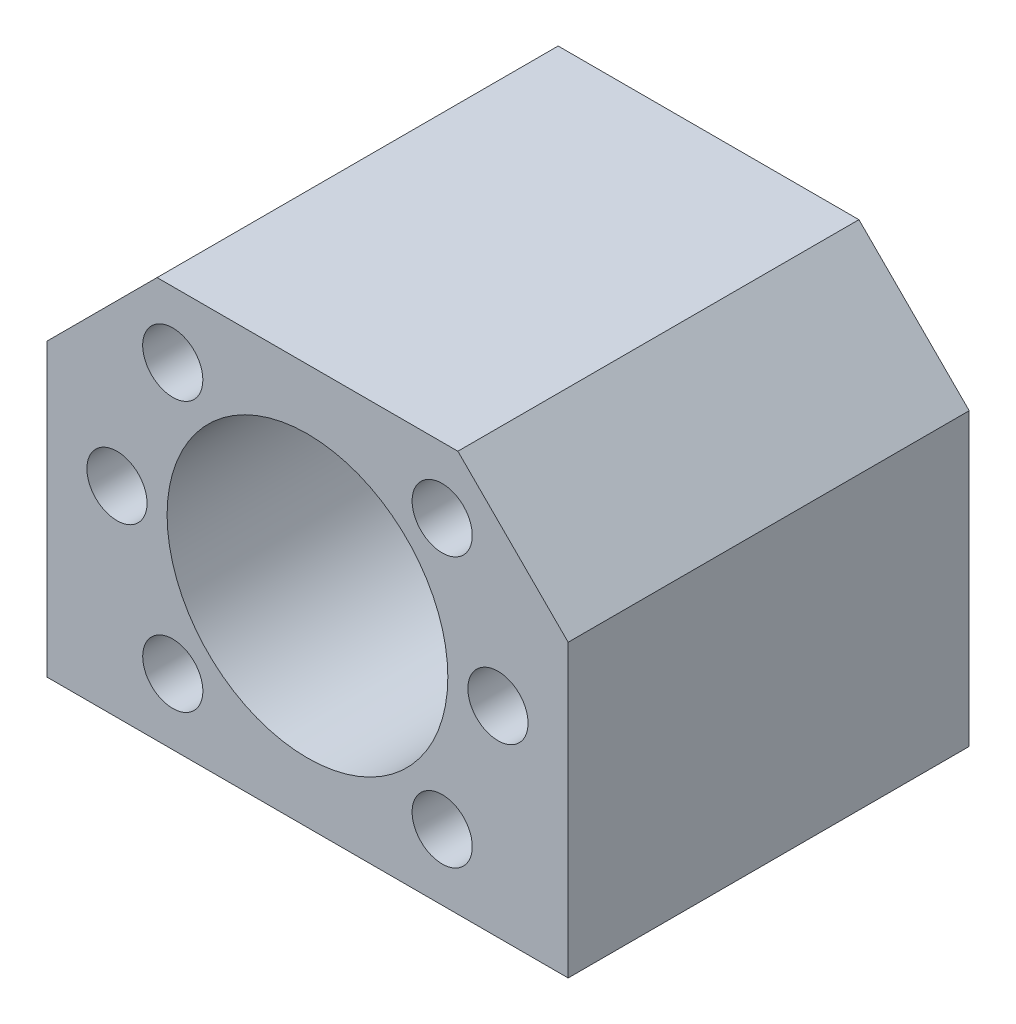
ISO-10303-21;
HEADER;
FILE_DESCRIPTION(('STEP AP214'),'2;1');
FILE_NAME('part.step','',(''),(''),'','','');
FILE_SCHEMA(('AUTOMOTIVE_DESIGN { 1 0 10303 214 1 1 1 1 }'));
ENDSEC;
DATA;
#1=APPLICATION_CONTEXT('core data for automotive mechanical design processes');
#2=APPLICATION_PROTOCOL_DEFINITION('international standard','automotive_design',2000,#1);
#3=PRODUCT_CONTEXT('',#1,'mechanical');
#4=PRODUCT('Part','Part','',(#3));
#5=PRODUCT_RELATED_PRODUCT_CATEGORY('part','',(#4));
#6=PRODUCT_DEFINITION_FORMATION('','',#4);
#7=PRODUCT_DEFINITION_CONTEXT('part definition',#1,'design');
#8=PRODUCT_DEFINITION('design','',#6,#7);
#9=PRODUCT_DEFINITION_SHAPE('','',#8);
#10=(LENGTH_UNIT() NAMED_UNIT(*) SI_UNIT(.MILLI.,.METRE.));
#11=(NAMED_UNIT(*) PLANE_ANGLE_UNIT() SI_UNIT($,.RADIAN.));
#12=(NAMED_UNIT(*) SI_UNIT($,.STERADIAN.) SOLID_ANGLE_UNIT());
#13=UNCERTAINTY_MEASURE_WITH_UNIT(LENGTH_MEASURE(1.E-05),#10,'distance_accuracy_value','');
#14=(GEOMETRIC_REPRESENTATION_CONTEXT(3) GLOBAL_UNCERTAINTY_ASSIGNED_CONTEXT((#13)) GLOBAL_UNIT_ASSIGNED_CONTEXT((#10,
#11,#12)) REPRESENTATION_CONTEXT('',''));
#15=CARTESIAN_POINT('',(0.,0.,0.));
#16=DIRECTION('',(0.,0.,1.));
#17=DIRECTION('',(1.,0.,0.));
#18=AXIS2_PLACEMENT_3D('',#15,#16,#17);
#19=CARTESIAN_POINT('',(0.,0.,40.));
#20=DIRECTION('',(1.,0.,0.));
#21=DIRECTION('',(0.,0.,-1.));
#22=AXIS2_PLACEMENT_3D('',#19,#20,#21);
#23=PLANE('',#22);
#24=DIRECTION('',(0.,-1.,0.));
#25=VECTOR('',#24,1.);
#26=CARTESIAN_POINT('',(0.,0.,40.));
#27=LINE('',#26,#25);
#28=CARTESIAN_POINT('',(0.,29.,40.));
#29=VERTEX_POINT('',#28);
#30=CARTESIAN_POINT('',(0.,0.,40.));
#31=VERTEX_POINT('',#30);
#32=EDGE_CURVE('E87',#29,#31,#27,.T.);
#33=ORIENTED_EDGE('',*,*,#32,.F.);
#34=DIRECTION('',(0.,0.,-1.));
#35=VECTOR('',#34,1.);
#36=CARTESIAN_POINT('',(0.,29.,40.));
#37=LINE('',#36,#35);
#38=CARTESIAN_POINT('',(0.,29.,0.));
#39=VERTEX_POINT('',#38);
#40=EDGE_CURVE('E110',#29,#39,#37,.T.);
#41=ORIENTED_EDGE('',*,*,#40,.T.);
#42=DIRECTION('',(0.,-1.,0.));
#43=VECTOR('',#42,1.);
#44=CARTESIAN_POINT('',(0.,0.,0.));
#45=LINE('',#44,#43);
#46=CARTESIAN_POINT('',(0.,0.,0.));
#47=VERTEX_POINT('',#46);
#48=EDGE_CURVE('E108',#39,#47,#45,.T.);
#49=ORIENTED_EDGE('',*,*,#48,.T.);
#50=DIRECTION('',(0.,0.,-1.));
#51=VECTOR('',#50,1.);
#52=CARTESIAN_POINT('',(0.,0.,40.));
#53=LINE('',#52,#51);
#54=EDGE_CURVE('E102',#31,#47,#53,.T.);
#55=ORIENTED_EDGE('',*,*,#54,.F.);
#56=EDGE_LOOP('',(#33,#41,#49,#55));
#57=FACE_BOUND('',#56,.T.);
#58=ADVANCED_FACE('F33',(#57),#23,.F.);
#59=CARTESIAN_POINT('',(0.,0.,40.));
#60=DIRECTION('',(0.,1.,0.));
#61=DIRECTION('',(0.,0.,1.));
#62=AXIS2_PLACEMENT_3D('',#59,#60,#61);
#63=PLANE('',#62);
#64=CARTESIAN_POINT('',(46.,0.,32.));
#65=DIRECTION('',(0.,-1.,0.));
#66=DIRECTION('',(0.,0.,1.));
#67=AXIS2_PLACEMENT_3D('',#64,#65,#66);
#68=CIRCLE('',#67,3.);
#69=CARTESIAN_POINT('',(46.,0.,35.));
#70=VERTEX_POINT('',#69);
#71=EDGE_CURVE('E204',#70,#70,#68,.T.);
#72=ORIENTED_EDGE('',*,*,#71,.F.);
#73=EDGE_LOOP('',(#72));
#74=FACE_BOUND('',#73,.T.);
#75=CARTESIAN_POINT('',(46.,0.,8.));
#76=DIRECTION('',(0.,-1.,0.));
#77=DIRECTION('',(0.,0.,-1.));
#78=AXIS2_PLACEMENT_3D('',#75,#76,#77);
#79=CIRCLE('',#78,3.);
#80=CARTESIAN_POINT('',(46.,0.,5.));
#81=VERTEX_POINT('',#80);
#82=EDGE_CURVE('E198',#81,#81,#79,.T.);
#83=ORIENTED_EDGE('',*,*,#82,.F.);
#84=EDGE_LOOP('',(#83));
#85=FACE_BOUND('',#84,.T.);
#86=CARTESIAN_POINT('',(6.,0.,8.));
#87=DIRECTION('',(0.,-1.,0.));
#88=DIRECTION('',(0.,0.,1.));
#89=AXIS2_PLACEMENT_3D('',#86,#87,#88);
#90=CIRCLE('',#89,3.);
#91=CARTESIAN_POINT('',(6.,0.,11.));
#92=VERTEX_POINT('',#91);
#93=EDGE_CURVE('E192',#92,#92,#90,.T.);
#94=ORIENTED_EDGE('',*,*,#93,.F.);
#95=EDGE_LOOP('',(#94));
#96=FACE_BOUND('',#95,.T.);
#97=CARTESIAN_POINT('',(6.,0.,32.));
#98=DIRECTION('',(0.,-1.,0.));
#99=DIRECTION('',(0.,0.,-1.));
#100=AXIS2_PLACEMENT_3D('',#97,#98,#99);
#101=CIRCLE('',#100,3.);
#102=CARTESIAN_POINT('',(6.,0.,29.));
#103=VERTEX_POINT('',#102);
#104=EDGE_CURVE('E186',#103,#103,#101,.T.);
#105=ORIENTED_EDGE('',*,*,#104,.F.);
#106=EDGE_LOOP('',(#105));
#107=FACE_BOUND('',#106,.T.);
#108=DIRECTION('',(1.,0.,0.));
#109=VECTOR('',#108,1.);
#110=CARTESIAN_POINT('',(0.,0.,0.));
#111=LINE('',#110,#109);
#112=CARTESIAN_POINT('',(52.,0.,0.));
#113=VERTEX_POINT('',#112);
#114=EDGE_CURVE('E137',#47,#113,#111,.T.);
#115=ORIENTED_EDGE('',*,*,#114,.T.);
#116=DIRECTION('',(0.,0.,-1.));
#117=VECTOR('',#116,1.);
#118=CARTESIAN_POINT('',(52.,0.,40.));
#119=LINE('',#118,#117);
#120=CARTESIAN_POINT('',(52.,0.,40.));
#121=VERTEX_POINT('',#120);
#122=EDGE_CURVE('E104',#121,#113,#119,.T.);
#123=ORIENTED_EDGE('',*,*,#122,.F.);
#124=DIRECTION('',(1.,0.,0.));
#125=VECTOR('',#124,1.);
#126=CARTESIAN_POINT('',(0.,0.,40.));
#127=LINE('',#126,#125);
#128=EDGE_CURVE('E90',#31,#121,#127,.T.);
#129=ORIENTED_EDGE('',*,*,#128,.F.);
#130=ORIENTED_EDGE('',*,*,#54,.T.);
#131=EDGE_LOOP('',(#115,#123,#129,#130));
#132=FACE_BOUND('',#131,.T.);
#133=ADVANCED_FACE('F101',(#74,#85,#96,#107,#132),#63,.F.);
#134=CARTESIAN_POINT('',(52.,0.,40.));
#135=DIRECTION('',(-1.,0.,0.));
#136=DIRECTION('',(0.,0.,1.));
#137=AXIS2_PLACEMENT_3D('',#134,#135,#136);
#138=PLANE('',#137);
#139=DIRECTION('',(0.,1.,0.));
#140=VECTOR('',#139,1.);
#141=CARTESIAN_POINT('',(52.,0.,0.));
#142=LINE('',#141,#140);
#143=CARTESIAN_POINT('',(52.,29.,0.));
#144=VERTEX_POINT('',#143);
#145=EDGE_CURVE('E135',#113,#144,#142,.T.);
#146=ORIENTED_EDGE('',*,*,#145,.T.);
#147=DIRECTION('',(0.,0.,1.));
#148=VECTOR('',#147,1.);
#149=CARTESIAN_POINT('',(52.,29.,40.));
#150=LINE('',#149,#148);
#151=CARTESIAN_POINT('',(52.,29.,40.));
#152=VERTEX_POINT('',#151);
#153=EDGE_CURVE('E11',#144,#152,#150,.T.);
#154=ORIENTED_EDGE('',*,*,#153,.T.);
#155=DIRECTION('',(0.,1.,0.));
#156=VECTOR('',#155,1.);
#157=CARTESIAN_POINT('',(52.,0.,40.));
#158=LINE('',#157,#156);
#159=EDGE_CURVE('E105',#121,#152,#158,.T.);
#160=ORIENTED_EDGE('',*,*,#159,.F.);
#161=ORIENTED_EDGE('',*,*,#122,.T.);
#162=EDGE_LOOP('',(#146,#154,#160,#161));
#163=FACE_BOUND('',#162,.T.);
#164=ADVANCED_FACE('F136',(#163),#138,.F.);
#165=CARTESIAN_POINT('',(0.,40.,40.));
#166=DIRECTION('',(0.,-1.,0.));
#167=DIRECTION('',(0.,0.,-1.));
#168=AXIS2_PLACEMENT_3D('',#165,#166,#167);
#169=PLANE('',#168);
#170=DIRECTION('',(-1.,0.,0.));
#171=VECTOR('',#170,1.);
#172=CARTESIAN_POINT('',(0.,40.,0.));
#173=LINE('',#172,#171);
#174=CARTESIAN_POINT('',(41.,40.,0.));
#175=VERTEX_POINT('',#174);
#176=CARTESIAN_POINT('',(11.,40.,0.));
#177=VERTEX_POINT('',#176);
#178=EDGE_CURVE('E97',#175,#177,#173,.T.);
#179=ORIENTED_EDGE('',*,*,#178,.T.);
#180=DIRECTION('',(0.,0.,1.));
#181=VECTOR('',#180,1.);
#182=CARTESIAN_POINT('',(11.,40.,40.));
#183=LINE('',#182,#181);
#184=CARTESIAN_POINT('',(11.,40.,40.));
#185=VERTEX_POINT('',#184);
#186=EDGE_CURVE('E54',#177,#185,#183,.T.);
#187=ORIENTED_EDGE('',*,*,#186,.T.);
#188=DIRECTION('',(-1.,0.,0.));
#189=VECTOR('',#188,1.);
#190=CARTESIAN_POINT('',(0.,40.,40.));
#191=LINE('',#190,#189);
#192=CARTESIAN_POINT('',(41.,40.,40.));
#193=VERTEX_POINT('',#192);
#194=EDGE_CURVE('E114',#193,#185,#191,.T.);
#195=ORIENTED_EDGE('',*,*,#194,.F.);
#196=DIRECTION('',(0.,0.,-1.));
#197=VECTOR('',#196,1.);
#198=CARTESIAN_POINT('',(41.,40.,40.));
#199=LINE('',#198,#197);
#200=EDGE_CURVE('E121',#193,#175,#199,.T.);
#201=ORIENTED_EDGE('',*,*,#200,.T.);
#202=EDGE_LOOP('',(#179,#187,#195,#201));
#203=FACE_BOUND('',#202,.T.);
#204=ADVANCED_FACE('F129',(#203),#169,.F.);
#205=CARTESIAN_POINT('',(0.,0.,40.));
#206=DIRECTION('',(0.,0.,-1.));
#207=DIRECTION('',(-1.,0.,0.));
#208=AXIS2_PLACEMENT_3D('',#205,#206,#207);
#209=PLANE('',#208);
#210=CARTESIAN_POINT('',(45.,20.,40.));
#211=DIRECTION('',(0.,0.,1.));
#212=DIRECTION('',(-1.,0.,0.));
#213=AXIS2_PLACEMENT_3D('',#210,#211,#212);
#214=CIRCLE('',#213,3.);
#215=CARTESIAN_POINT('',(42.,20.,40.));
#216=VERTEX_POINT('',#215);
#217=EDGE_CURVE('E180',#216,#216,#214,.T.);
#218=ORIENTED_EDGE('',*,*,#217,.F.);
#219=EDGE_LOOP('',(#218));
#220=FACE_BOUND('',#219,.T.);
#221=CARTESIAN_POINT('',(39.4350288425445,33.4350288425443,40.));
#222=DIRECTION('',(0.,0.,1.));
#223=DIRECTION('',(-1.,0.,0.));
#224=AXIS2_PLACEMENT_3D('',#221,#222,#223);
#225=CIRCLE('',#224,3.);
#226=CARTESIAN_POINT('',(36.4350288425445,33.4350288425443,40.));
#227=VERTEX_POINT('',#226);
#228=EDGE_CURVE('E174',#227,#227,#225,.T.);
#229=ORIENTED_EDGE('',*,*,#228,.F.);
#230=EDGE_LOOP('',(#229));
#231=FACE_BOUND('',#230,.T.);
#232=CARTESIAN_POINT('',(39.4350288425445,6.56497115745567,40.));
#233=DIRECTION('',(0.,0.,1.));
#234=DIRECTION('',(1.,0.,0.));
#235=AXIS2_PLACEMENT_3D('',#232,#233,#234);
#236=CIRCLE('',#235,3.00000000000001);
#237=CARTESIAN_POINT('',(42.4350288425445,6.56497115745567,40.));
#238=VERTEX_POINT('',#237);
#239=EDGE_CURVE('E168',#238,#238,#236,.T.);
#240=ORIENTED_EDGE('',*,*,#239,.F.);
#241=EDGE_LOOP('',(#240));
#242=FACE_BOUND('',#241,.T.);
#243=CARTESIAN_POINT('',(12.5649711574555,6.56497115745567,40.));
#244=DIRECTION('',(0.,0.,1.));
#245=DIRECTION('',(-1.,0.,0.));
#246=AXIS2_PLACEMENT_3D('',#243,#244,#245);
#247=CIRCLE('',#246,3.00000000000001);
#248=CARTESIAN_POINT('',(9.56497115745552,6.56497115745567,40.));
#249=VERTEX_POINT('',#248);
#250=EDGE_CURVE('E162',#249,#249,#247,.T.);
#251=ORIENTED_EDGE('',*,*,#250,.F.);
#252=EDGE_LOOP('',(#251));
#253=FACE_BOUND('',#252,.T.);
#254=CARTESIAN_POINT('',(12.5649711574555,33.4350288425443,40.));
#255=DIRECTION('',(0.,0.,1.));
#256=DIRECTION('',(1.,0.,0.));
#257=AXIS2_PLACEMENT_3D('',#254,#255,#256);
#258=CIRCLE('',#257,3.);
#259=CARTESIAN_POINT('',(15.5649711574555,33.4350288425443,40.));
#260=VERTEX_POINT('',#259);
#261=EDGE_CURVE('E156',#260,#260,#258,.T.);
#262=ORIENTED_EDGE('',*,*,#261,.F.);
#263=EDGE_LOOP('',(#262));
#264=FACE_BOUND('',#263,.T.);
#265=CARTESIAN_POINT('',(7.,20.,40.));
#266=DIRECTION('',(0.,0.,1.));
#267=DIRECTION('',(1.,0.,0.));
#268=AXIS2_PLACEMENT_3D('',#265,#266,#267);
#269=CIRCLE('',#268,3.);
#270=CARTESIAN_POINT('',(10.,20.,40.));
#271=VERTEX_POINT('',#270);
#272=EDGE_CURVE('E150',#271,#271,#269,.T.);
#273=ORIENTED_EDGE('',*,*,#272,.F.);
#274=EDGE_LOOP('',(#273));
#275=FACE_BOUND('',#274,.T.);
#276=CARTESIAN_POINT('',(26.,20.,40.));
#277=DIRECTION('',(0.,0.,1.));
#278=DIRECTION('',(1.,0.,0.));
#279=AXIS2_PLACEMENT_3D('',#276,#277,#278);
#280=CIRCLE('',#279,14.);
#281=CARTESIAN_POINT('',(40.,20.,40.));
#282=VERTEX_POINT('',#281);
#283=EDGE_CURVE('E144',#282,#282,#280,.T.);
#284=ORIENTED_EDGE('',*,*,#283,.F.);
#285=EDGE_LOOP('',(#284));
#286=FACE_BOUND('',#285,.T.);
#287=ORIENTED_EDGE('',*,*,#194,.T.);
#288=DIRECTION('',(0.707106781186549,0.707106781186546,0.));
#289=VECTOR('',#288,1.);
#290=CARTESIAN_POINT('',(0.,29.,40.));
#291=LINE('',#290,#289);
#292=EDGE_CURVE('E41',#185,#29,#291,.F.);
#293=ORIENTED_EDGE('',*,*,#292,.T.);
#294=ORIENTED_EDGE('',*,*,#32,.T.);
#295=ORIENTED_EDGE('',*,*,#128,.T.);
#296=ORIENTED_EDGE('',*,*,#159,.T.);
#297=DIRECTION('',(0.707106781186546,-0.707106781186549,0.));
#298=VECTOR('',#297,1.);
#299=CARTESIAN_POINT('',(41.,40.,40.));
#300=LINE('',#299,#298);
#301=EDGE_CURVE('E125',#152,#193,#300,.F.);
#302=ORIENTED_EDGE('',*,*,#301,.T.);
#303=EDGE_LOOP('',(#287,#293,#294,#295,#296,#302));
#304=FACE_BOUND('',#303,.T.);
#305=ADVANCED_FACE('F89',(#220,#231,#242,#253,#264,#275,#286,#304),#209,.F.);
#306=CARTESIAN_POINT('',(0.,0.,0.));
#307=DIRECTION('',(0.,0.,-1.));
#308=DIRECTION('',(-1.,0.,0.));
#309=AXIS2_PLACEMENT_3D('',#306,#307,#308);
#310=PLANE('',#309);
#311=CARTESIAN_POINT('',(26.,20.,0.));
#312=DIRECTION('',(0.,0.,1.));
#313=DIRECTION('',(1.,0.,0.));
#314=AXIS2_PLACEMENT_3D('',#311,#312,#313);
#315=CIRCLE('',#314,14.);
#316=CARTESIAN_POINT('',(40.,20.,0.));
#317=VERTEX_POINT('',#316);
#318=EDGE_CURVE('E141',#317,#317,#315,.T.);
#319=ORIENTED_EDGE('',*,*,#318,.T.);
#320=EDGE_LOOP('',(#319));
#321=FACE_BOUND('',#320,.T.);
#322=ORIENTED_EDGE('',*,*,#48,.F.);
#323=DIRECTION('',(-0.707106781186549,-0.707106781186546,0.));
#324=VECTOR('',#323,1.);
#325=CARTESIAN_POINT('',(-14.5,14.5000000000001,0.));
#326=LINE('',#325,#324);
#327=EDGE_CURVE('E119',#39,#177,#326,.F.);
#328=ORIENTED_EDGE('',*,*,#327,.T.);
#329=ORIENTED_EDGE('',*,*,#178,.F.);
#330=DIRECTION('',(-0.707106781186546,0.707106781186549,0.));
#331=VECTOR('',#330,1.);
#332=CARTESIAN_POINT('',(40.5000000000001,40.4999999999999,0.));
#333=LINE('',#332,#331);
#334=EDGE_CURVE('E112',#175,#144,#333,.F.);
#335=ORIENTED_EDGE('',*,*,#334,.T.);
#336=ORIENTED_EDGE('',*,*,#145,.F.);
#337=ORIENTED_EDGE('',*,*,#114,.F.);
#338=EDGE_LOOP('',(#322,#328,#329,#335,#336,#337));
#339=FACE_BOUND('',#338,.T.);
#340=ADVANCED_FACE('F134',(#321,#339),#310,.T.);
#341=CARTESIAN_POINT('',(26.,20.,0.));
#342=DIRECTION('',(0.,0.,1.));
#343=DIRECTION('',(1.,0.,0.));
#344=AXIS2_PLACEMENT_3D('',#341,#342,#343);
#345=CYLINDRICAL_SURFACE('',#344,14.);
#346=ORIENTED_EDGE('',*,*,#318,.F.);
#347=EDGE_LOOP('',(#346));
#348=FACE_BOUND('',#347,.T.);
#349=ORIENTED_EDGE('',*,*,#283,.T.);
#350=EDGE_LOOP('',(#349));
#351=FACE_BOUND('',#350,.T.);
#352=ADVANCED_FACE('F301',(#348,#351),#345,.F.);
#353=CARTESIAN_POINT('',(7.,20.,30.));
#354=DIRECTION('',(0.,0.,1.));
#355=DIRECTION('',(1.,0.,0.));
#356=AXIS2_PLACEMENT_3D('',#353,#354,#355);
#357=CYLINDRICAL_SURFACE('',#356,3.);
#358=CARTESIAN_POINT('',(7.,20.,30.));
#359=DIRECTION('',(0.,0.,1.));
#360=DIRECTION('',(1.,0.,0.));
#361=AXIS2_PLACEMENT_3D('',#358,#359,#360);
#362=CIRCLE('',#361,3.);
#363=CARTESIAN_POINT('',(10.,20.,30.));
#364=VERTEX_POINT('',#363);
#365=EDGE_CURVE('E147',#364,#364,#362,.T.);
#366=ORIENTED_EDGE('',*,*,#365,.F.);
#367=EDGE_LOOP('',(#366));
#368=FACE_BOUND('',#367,.T.);
#369=ORIENTED_EDGE('',*,*,#272,.T.);
#370=EDGE_LOOP('',(#369));
#371=FACE_BOUND('',#370,.T.);
#372=ADVANCED_FACE('F297',(#368,#371),#357,.F.);
#373=CARTESIAN_POINT('',(7.,20.,30.));
#374=DIRECTION('',(0.,0.,1.));
#375=DIRECTION('',(1.,0.,0.));
#376=AXIS2_PLACEMENT_3D('',#373,#374,#375);
#377=PLANE('',#376);
#378=ORIENTED_EDGE('',*,*,#365,.T.);
#379=EDGE_LOOP('',(#378));
#380=FACE_BOUND('',#379,.T.);
#381=ADVANCED_FACE('F293',(#380),#377,.T.);
#382=CARTESIAN_POINT('',(12.5649711574555,33.4350288425443,30.));
#383=DIRECTION('',(0.,0.,1.));
#384=DIRECTION('',(1.,0.,0.));
#385=AXIS2_PLACEMENT_3D('',#382,#383,#384);
#386=CYLINDRICAL_SURFACE('',#385,3.);
#387=CARTESIAN_POINT('',(12.5649711574555,33.4350288425443,30.));
#388=DIRECTION('',(0.,0.,1.));
#389=DIRECTION('',(1.,0.,0.));
#390=AXIS2_PLACEMENT_3D('',#387,#388,#389);
#391=CIRCLE('',#390,3.);
#392=CARTESIAN_POINT('',(15.5649711574555,33.4350288425443,30.));
#393=VERTEX_POINT('',#392);
#394=EDGE_CURVE('E153',#393,#393,#391,.T.);
#395=ORIENTED_EDGE('',*,*,#394,.F.);
#396=EDGE_LOOP('',(#395));
#397=FACE_BOUND('',#396,.T.);
#398=ORIENTED_EDGE('',*,*,#261,.T.);
#399=EDGE_LOOP('',(#398));
#400=FACE_BOUND('',#399,.T.);
#401=ADVANCED_FACE('F289',(#397,#400),#386,.F.);
#402=CARTESIAN_POINT('',(12.5649711574555,33.4350288425443,30.));
#403=DIRECTION('',(0.,0.,1.));
#404=DIRECTION('',(1.,0.,0.));
#405=AXIS2_PLACEMENT_3D('',#402,#403,#404);
#406=PLANE('',#405);
#407=ORIENTED_EDGE('',*,*,#394,.T.);
#408=EDGE_LOOP('',(#407));
#409=FACE_BOUND('',#408,.T.);
#410=ADVANCED_FACE('F285',(#409),#406,.T.);
#411=CARTESIAN_POINT('',(12.5649711574555,6.56497115745567,30.));
#412=DIRECTION('',(0.,0.,1.));
#413=DIRECTION('',(1.,0.,0.));
#414=AXIS2_PLACEMENT_3D('',#411,#412,#413);
#415=CYLINDRICAL_SURFACE('',#414,3.00000000000001);
#416=CARTESIAN_POINT('',(12.5649711574555,6.56497115745567,30.));
#417=DIRECTION('',(0.,0.,1.));
#418=DIRECTION('',(-1.,0.,0.));
#419=AXIS2_PLACEMENT_3D('',#416,#417,#418);
#420=CIRCLE('',#419,3.00000000000001);
#421=CARTESIAN_POINT('',(9.56497115745552,6.56497115745567,30.));
#422=VERTEX_POINT('',#421);
#423=EDGE_CURVE('E159',#422,#422,#420,.T.);
#424=ORIENTED_EDGE('',*,*,#423,.F.);
#425=EDGE_LOOP('',(#424));
#426=FACE_BOUND('',#425,.T.);
#427=ORIENTED_EDGE('',*,*,#250,.T.);
#428=EDGE_LOOP('',(#427));
#429=FACE_BOUND('',#428,.T.);
#430=ADVANCED_FACE('F281',(#426,#429),#415,.F.);
#431=CARTESIAN_POINT('',(12.5649711574555,6.56497115745567,30.));
#432=DIRECTION('',(0.,0.,-1.));
#433=DIRECTION('',(-1.,0.,0.));
#434=AXIS2_PLACEMENT_3D('',#431,#432,#433);
#435=PLANE('',#434);
#436=ORIENTED_EDGE('',*,*,#423,.T.);
#437=EDGE_LOOP('',(#436));
#438=FACE_BOUND('',#437,.T.);
#439=ADVANCED_FACE('F277',(#438),#435,.F.);
#440=CARTESIAN_POINT('',(39.4350288425445,6.56497115745567,30.));
#441=DIRECTION('',(0.,0.,1.));
#442=DIRECTION('',(1.,0.,0.));
#443=AXIS2_PLACEMENT_3D('',#440,#441,#442);
#444=CYLINDRICAL_SURFACE('',#443,3.00000000000001);
#445=CARTESIAN_POINT('',(39.4350288425445,6.56497115745567,30.));
#446=DIRECTION('',(0.,0.,1.));
#447=DIRECTION('',(1.,0.,0.));
#448=AXIS2_PLACEMENT_3D('',#445,#446,#447);
#449=CIRCLE('',#448,3.00000000000001);
#450=CARTESIAN_POINT('',(42.4350288425445,6.56497115745567,30.));
#451=VERTEX_POINT('',#450);
#452=EDGE_CURVE('E165',#451,#451,#449,.T.);
#453=ORIENTED_EDGE('',*,*,#452,.F.);
#454=EDGE_LOOP('',(#453));
#455=FACE_BOUND('',#454,.T.);
#456=ORIENTED_EDGE('',*,*,#239,.T.);
#457=EDGE_LOOP('',(#456));
#458=FACE_BOUND('',#457,.T.);
#459=ADVANCED_FACE('F273',(#455,#458),#444,.F.);
#460=CARTESIAN_POINT('',(39.4350288425445,6.56497115745567,30.));
#461=DIRECTION('',(0.,0.,1.));
#462=DIRECTION('',(1.,0.,0.));
#463=AXIS2_PLACEMENT_3D('',#460,#461,#462);
#464=PLANE('',#463);
#465=ORIENTED_EDGE('',*,*,#452,.T.);
#466=EDGE_LOOP('',(#465));
#467=FACE_BOUND('',#466,.T.);
#468=ADVANCED_FACE('F269',(#467),#464,.T.);
#469=CARTESIAN_POINT('',(39.4350288425445,33.4350288425443,30.));
#470=DIRECTION('',(0.,0.,1.));
#471=DIRECTION('',(1.,0.,0.));
#472=AXIS2_PLACEMENT_3D('',#469,#470,#471);
#473=CYLINDRICAL_SURFACE('',#472,3.);
#474=CARTESIAN_POINT('',(39.4350288425445,33.4350288425443,30.));
#475=DIRECTION('',(0.,0.,1.));
#476=DIRECTION('',(-1.,0.,0.));
#477=AXIS2_PLACEMENT_3D('',#474,#475,#476);
#478=CIRCLE('',#477,3.);
#479=CARTESIAN_POINT('',(36.4350288425445,33.4350288425443,30.));
#480=VERTEX_POINT('',#479);
#481=EDGE_CURVE('E171',#480,#480,#478,.T.);
#482=ORIENTED_EDGE('',*,*,#481,.F.);
#483=EDGE_LOOP('',(#482));
#484=FACE_BOUND('',#483,.T.);
#485=ORIENTED_EDGE('',*,*,#228,.T.);
#486=EDGE_LOOP('',(#485));
#487=FACE_BOUND('',#486,.T.);
#488=ADVANCED_FACE('F265',(#484,#487),#473,.F.);
#489=CARTESIAN_POINT('',(39.4350288425445,33.4350288425443,30.));
#490=DIRECTION('',(0.,0.,-1.));
#491=DIRECTION('',(-1.,0.,0.));
#492=AXIS2_PLACEMENT_3D('',#489,#490,#491);
#493=PLANE('',#492);
#494=ORIENTED_EDGE('',*,*,#481,.T.);
#495=EDGE_LOOP('',(#494));
#496=FACE_BOUND('',#495,.T.);
#497=ADVANCED_FACE('F259',(#496),#493,.F.);
#498=CARTESIAN_POINT('',(45.,20.,30.));
#499=DIRECTION('',(0.,0.,1.));
#500=DIRECTION('',(1.,0.,0.));
#501=AXIS2_PLACEMENT_3D('',#498,#499,#500);
#502=CYLINDRICAL_SURFACE('',#501,3.);
#503=CARTESIAN_POINT('',(45.,20.,30.));
#504=DIRECTION('',(0.,0.,1.));
#505=DIRECTION('',(-1.,0.,0.));
#506=AXIS2_PLACEMENT_3D('',#503,#504,#505);
#507=CIRCLE('',#506,3.);
#508=CARTESIAN_POINT('',(42.,20.,30.));
#509=VERTEX_POINT('',#508);
#510=EDGE_CURVE('E177',#509,#509,#507,.T.);
#511=ORIENTED_EDGE('',*,*,#510,.F.);
#512=EDGE_LOOP('',(#511));
#513=FACE_BOUND('',#512,.T.);
#514=ORIENTED_EDGE('',*,*,#217,.T.);
#515=EDGE_LOOP('',(#514));
#516=FACE_BOUND('',#515,.T.);
#517=ADVANCED_FACE('F254',(#513,#516),#502,.F.);
#518=CARTESIAN_POINT('',(45.,20.,30.));
#519=DIRECTION('',(0.,0.,-1.));
#520=DIRECTION('',(-1.,0.,0.));
#521=AXIS2_PLACEMENT_3D('',#518,#519,#520);
#522=PLANE('',#521);
#523=ORIENTED_EDGE('',*,*,#510,.T.);
#524=EDGE_LOOP('',(#523));
#525=FACE_BOUND('',#524,.T.);
#526=ADVANCED_FACE('F249',(#525),#522,.F.);
#527=CARTESIAN_POINT('',(0.,29.,40.));
#528=DIRECTION('',(0.707106781186546,-0.707106781186549,0.));
#529=DIRECTION('',(0.,0.,-1.));
#530=AXIS2_PLACEMENT_3D('',#527,#528,#529);
#531=PLANE('',#530);
#532=ORIENTED_EDGE('',*,*,#292,.F.);
#533=ORIENTED_EDGE('',*,*,#186,.F.);
#534=ORIENTED_EDGE('',*,*,#327,.F.);
#535=ORIENTED_EDGE('',*,*,#40,.F.);
#536=EDGE_LOOP('',(#532,#533,#534,#535));
#537=FACE_BOUND('',#536,.T.);
#538=ADVANCED_FACE('F240',(#537),#531,.F.);
#539=CARTESIAN_POINT('',(41.,40.,40.));
#540=DIRECTION('',(-0.707106781186549,-0.707106781186546,0.));
#541=DIRECTION('',(0.,0.,-1.));
#542=AXIS2_PLACEMENT_3D('',#539,#540,#541);
#543=PLANE('',#542);
#544=ORIENTED_EDGE('',*,*,#301,.F.);
#545=ORIENTED_EDGE('',*,*,#153,.F.);
#546=ORIENTED_EDGE('',*,*,#334,.F.);
#547=ORIENTED_EDGE('',*,*,#200,.F.);
#548=EDGE_LOOP('',(#544,#545,#546,#547));
#549=FACE_BOUND('',#548,.T.);
#550=ADVANCED_FACE('F35',(#549),#543,.F.);
#551=CARTESIAN_POINT('',(6.,10.,32.));
#552=DIRECTION('',(0.,-1.,0.));
#553=DIRECTION('',(0.,0.,-1.));
#554=AXIS2_PLACEMENT_3D('',#551,#552,#553);
#555=CYLINDRICAL_SURFACE('',#554,3.);
#556=CARTESIAN_POINT('',(6.,10.,32.));
#557=DIRECTION('',(0.,-1.,0.));
#558=DIRECTION('',(0.,0.,-1.));
#559=AXIS2_PLACEMENT_3D('',#556,#557,#558);
#560=CIRCLE('',#559,3.);
#561=CARTESIAN_POINT('',(6.,10.,29.));
#562=VERTEX_POINT('',#561);
#563=EDGE_CURVE('E183',#562,#562,#560,.T.);
#564=ORIENTED_EDGE('',*,*,#563,.F.);
#565=EDGE_LOOP('',(#564));
#566=FACE_BOUND('',#565,.T.);
#567=ORIENTED_EDGE('',*,*,#104,.T.);
#568=EDGE_LOOP('',(#567));
#569=FACE_BOUND('',#568,.T.);
#570=ADVANCED_FACE('F228',(#566,#569),#555,.F.);
#571=CARTESIAN_POINT('',(6.,10.,32.));
#572=DIRECTION('',(0.,-1.,0.));
#573=DIRECTION('',(0.,0.,-1.));
#574=AXIS2_PLACEMENT_3D('',#571,#572,#573);
#575=PLANE('',#574);
#576=ORIENTED_EDGE('',*,*,#563,.T.);
#577=EDGE_LOOP('',(#576));
#578=FACE_BOUND('',#577,.T.);
#579=ADVANCED_FACE('F230',(#578),#575,.T.);
#580=CARTESIAN_POINT('',(6.,10.,8.));
#581=DIRECTION('',(0.,-1.,0.));
#582=DIRECTION('',(0.,0.,-1.));
#583=AXIS2_PLACEMENT_3D('',#580,#581,#582);
#584=CYLINDRICAL_SURFACE('',#583,3.);
#585=CARTESIAN_POINT('',(6.,10.,8.));
#586=DIRECTION('',(0.,-1.,0.));
#587=DIRECTION('',(0.,0.,1.));
#588=AXIS2_PLACEMENT_3D('',#585,#586,#587);
#589=CIRCLE('',#588,3.);
#590=CARTESIAN_POINT('',(6.,10.,11.));
#591=VERTEX_POINT('',#590);
#592=EDGE_CURVE('E189',#591,#591,#589,.T.);
#593=ORIENTED_EDGE('',*,*,#592,.F.);
#594=EDGE_LOOP('',(#593));
#595=FACE_BOUND('',#594,.T.);
#596=ORIENTED_EDGE('',*,*,#93,.T.);
#597=EDGE_LOOP('',(#596));
#598=FACE_BOUND('',#597,.T.);
#599=ADVANCED_FACE('F237',(#595,#598),#584,.F.);
#600=CARTESIAN_POINT('',(6.,10.,8.));
#601=DIRECTION('',(0.,1.,0.));
#602=DIRECTION('',(0.,0.,1.));
#603=AXIS2_PLACEMENT_3D('',#600,#601,#602);
#604=PLANE('',#603);
#605=ORIENTED_EDGE('',*,*,#592,.T.);
#606=EDGE_LOOP('',(#605));
#607=FACE_BOUND('',#606,.T.);
#608=ADVANCED_FACE('F443',(#607),#604,.F.);
#609=CARTESIAN_POINT('',(46.,10.,8.));
#610=DIRECTION('',(0.,-1.,0.));
#611=DIRECTION('',(0.,0.,-1.));
#612=AXIS2_PLACEMENT_3D('',#609,#610,#611);
#613=CYLINDRICAL_SURFACE('',#612,3.);
#614=CARTESIAN_POINT('',(46.,10.,8.));
#615=DIRECTION('',(0.,-1.,0.));
#616=DIRECTION('',(0.,0.,-1.));
#617=AXIS2_PLACEMENT_3D('',#614,#615,#616);
#618=CIRCLE('',#617,3.);
#619=CARTESIAN_POINT('',(46.,10.,5.));
#620=VERTEX_POINT('',#619);
#621=EDGE_CURVE('E195',#620,#620,#618,.T.);
#622=ORIENTED_EDGE('',*,*,#621,.F.);
#623=EDGE_LOOP('',(#622));
#624=FACE_BOUND('',#623,.T.);
#625=ORIENTED_EDGE('',*,*,#82,.T.);
#626=EDGE_LOOP('',(#625));
#627=FACE_BOUND('',#626,.T.);
#628=ADVANCED_FACE('F453',(#624,#627),#613,.F.);
#629=CARTESIAN_POINT('',(46.,10.,8.));
#630=DIRECTION('',(0.,-1.,0.));
#631=DIRECTION('',(0.,0.,-1.));
#632=AXIS2_PLACEMENT_3D('',#629,#630,#631);
#633=PLANE('',#632);
#634=ORIENTED_EDGE('',*,*,#621,.T.);
#635=EDGE_LOOP('',(#634));
#636=FACE_BOUND('',#635,.T.);
#637=ADVANCED_FACE('F215',(#636),#633,.T.);
#638=CARTESIAN_POINT('',(46.,10.,32.));
#639=DIRECTION('',(0.,-1.,0.));
#640=DIRECTION('',(0.,0.,-1.));
#641=AXIS2_PLACEMENT_3D('',#638,#639,#640);
#642=CYLINDRICAL_SURFACE('',#641,3.);
#643=CARTESIAN_POINT('',(46.,10.,32.));
#644=DIRECTION('',(0.,-1.,0.));
#645=DIRECTION('',(0.,0.,1.));
#646=AXIS2_PLACEMENT_3D('',#643,#644,#645);
#647=CIRCLE('',#646,3.);
#648=CARTESIAN_POINT('',(46.,10.,35.));
#649=VERTEX_POINT('',#648);
#650=EDGE_CURVE('E201',#649,#649,#647,.T.);
#651=ORIENTED_EDGE('',*,*,#650,.F.);
#652=EDGE_LOOP('',(#651));
#653=FACE_BOUND('',#652,.T.);
#654=ORIENTED_EDGE('',*,*,#71,.T.);
#655=EDGE_LOOP('',(#654));
#656=FACE_BOUND('',#655,.T.);
#657=ADVANCED_FACE('F212',(#653,#656),#642,.F.);
#658=CARTESIAN_POINT('',(46.,10.,32.));
#659=DIRECTION('',(0.,1.,0.));
#660=DIRECTION('',(0.,0.,1.));
#661=AXIS2_PLACEMENT_3D('',#658,#659,#660);
#662=PLANE('',#661);
#663=ORIENTED_EDGE('',*,*,#650,.T.);
#664=EDGE_LOOP('',(#663));
#665=FACE_BOUND('',#664,.T.);
#666=ADVANCED_FACE('F210',(#665),#662,.F.);
#667=CLOSED_SHELL('',(#58,#133,#164,#204,#305,#340,#352,#372,#381,#401,#410,#430,#439,#459,#468,
#488,#497,#517,#526,#538,#550,#570,#579,#599,#608,#628,#637,#657,#666));
#668=MANIFOLD_SOLID_BREP('B2',#667);
#669=ADVANCED_BREP_SHAPE_REPRESENTATION('',(#18,#668),#14);
#670=SHAPE_DEFINITION_REPRESENTATION(#9,#669);
ENDSEC;
END-ISO-10303-21;
